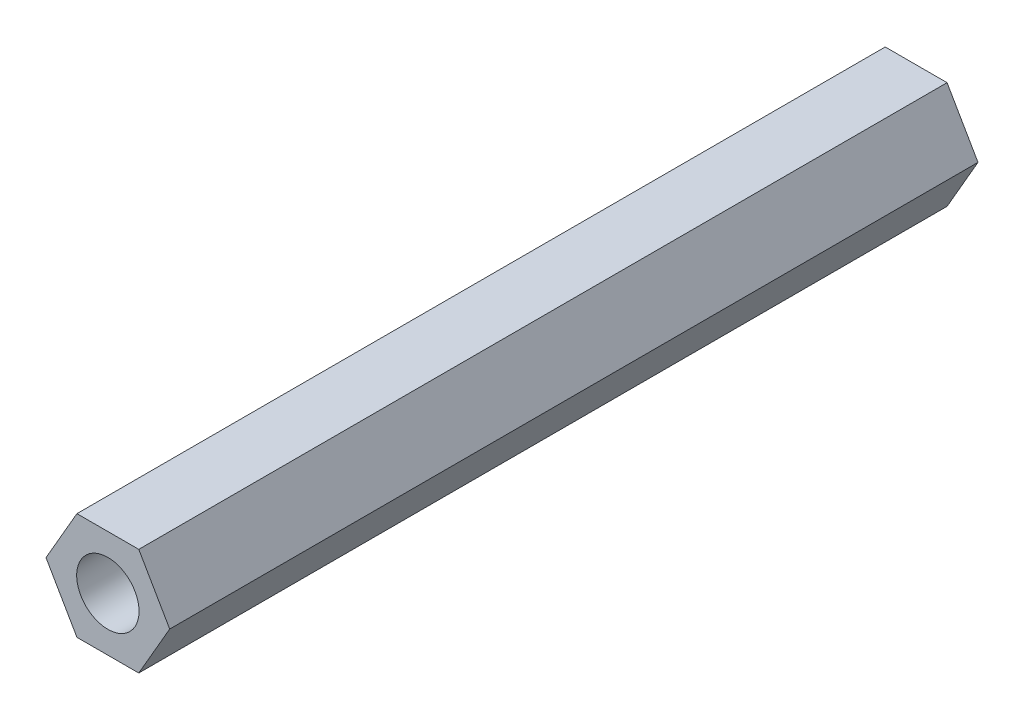
ISO-10303-21;
HEADER;
FILE_DESCRIPTION(('STEP AP214'),'2;1');
FILE_NAME('part.step','',(''),(''),'','','');
FILE_SCHEMA(('AUTOMOTIVE_DESIGN { 1 0 10303 214 1 1 1 1 }'));
ENDSEC;
DATA;
#1=APPLICATION_CONTEXT('core data for automotive mechanical design processes');
#2=APPLICATION_PROTOCOL_DEFINITION('international standard','automotive_design',2000,#1);
#3=PRODUCT_CONTEXT('',#1,'mechanical');
#4=PRODUCT('Part','Part','',(#3));
#5=PRODUCT_RELATED_PRODUCT_CATEGORY('part','',(#4));
#6=PRODUCT_DEFINITION_FORMATION('','',#4);
#7=PRODUCT_DEFINITION_CONTEXT('part definition',#1,'design');
#8=PRODUCT_DEFINITION('design','',#6,#7);
#9=PRODUCT_DEFINITION_SHAPE('','',#8);
#10=(LENGTH_UNIT() NAMED_UNIT(*) SI_UNIT(.MILLI.,.METRE.));
#11=(NAMED_UNIT(*) PLANE_ANGLE_UNIT() SI_UNIT($,.RADIAN.));
#12=(NAMED_UNIT(*) SI_UNIT($,.STERADIAN.) SOLID_ANGLE_UNIT());
#13=UNCERTAINTY_MEASURE_WITH_UNIT(LENGTH_MEASURE(1.E-05),#10,'distance_accuracy_value','');
#14=(GEOMETRIC_REPRESENTATION_CONTEXT(3) GLOBAL_UNCERTAINTY_ASSIGNED_CONTEXT((#13)) GLOBAL_UNIT_ASSIGNED_CONTEXT((#10,
#11,#12)) REPRESENTATION_CONTEXT('',''));
#15=CARTESIAN_POINT('',(0.,0.,0.));
#16=DIRECTION('',(0.,0.,1.));
#17=DIRECTION('',(1.,0.,0.));
#18=AXIS2_PLACEMENT_3D('',#15,#16,#17);
#19=CARTESIAN_POINT('',(0.,0.,-1.));
#20=DIRECTION('',(0.,0.,-1.));
#21=DIRECTION('',(1.,0.,0.));
#22=AXIS2_PLACEMENT_3D('',#19,#20,#21);
#23=CYLINDRICAL_SURFACE('',#22,1.6);
#24=CARTESIAN_POINT('',(0.,0.,0.));
#25=DIRECTION('',(0.,0.,-1.));
#26=DIRECTION('',(1.,0.,0.));
#27=AXIS2_PLACEMENT_3D('',#24,#25,#26);
#28=CIRCLE('',#27,1.6);
#29=CARTESIAN_POINT('',(1.6,0.,0.));
#30=VERTEX_POINT('',#29);
#31=EDGE_CURVE('E151',#30,#30,#28,.T.);
#32=ORIENTED_EDGE('',*,*,#31,.T.);
#33=DIRECTION('',(0.,0.,1.));
#34=VECTOR('',#33,1.);
#35=CARTESIAN_POINT('',(1.6,0.,-1.));
#36=LINE('',#35,#34);
#37=CARTESIAN_POINT('',(1.6,0.,41.5));
#38=VERTEX_POINT('',#37);
#39=EDGE_CURVE('E9',#30,#38,#36,.T.);
#40=ORIENTED_EDGE('',*,*,#39,.T.);
#41=CARTESIAN_POINT('',(0.,0.,41.5));
#42=DIRECTION('',(0.,0.,-1.));
#43=DIRECTION('',(1.,0.,0.));
#44=AXIS2_PLACEMENT_3D('',#41,#42,#43);
#45=CIRCLE('',#44,1.6);
#46=EDGE_CURVE('E166',#38,#38,#45,.T.);
#47=ORIENTED_EDGE('',*,*,#46,.F.);
#48=ORIENTED_EDGE('',*,*,#39,.F.);
#49=EDGE_LOOP('',(#32,#40,#47,#48));
#50=FACE_BOUND('',#49,.T.);
#51=ADVANCED_FACE('F15',(#50),#23,.F.);
#52=CARTESIAN_POINT('',(-3.175426480543,0.,0.));
#53=DIRECTION('',(0.866025403784329,0.50000000000019,0.));
#54=DIRECTION('',(0.,0.,-1.));
#55=AXIS2_PLACEMENT_3D('',#52,#53,#54);
#56=PLANE('',#55);
#57=DIRECTION('',(0.50000000000019,-0.866025403784329,0.));
#58=VECTOR('',#57,1.);
#59=CARTESIAN_POINT('',(-3.175426480543,0.,0.));
#60=LINE('',#59,#58);
#61=CARTESIAN_POINT('',(-3.175426480543,0.,0.));
#62=VERTEX_POINT('',#61);
#63=CARTESIAN_POINT('',(-1.587713240271,-2.75,0.));
#64=VERTEX_POINT('',#63);
#65=EDGE_CURVE('E147',#62,#64,#60,.T.);
#66=ORIENTED_EDGE('',*,*,#65,.T.);
#67=DIRECTION('',(0.,0.,1.));
#68=VECTOR('',#67,1.);
#69=CARTESIAN_POINT('',(-1.587713240271,-2.75,0.));
#70=LINE('',#69,#68);
#71=CARTESIAN_POINT('',(-1.587713240271,-2.75,41.5));
#72=VERTEX_POINT('',#71);
#73=EDGE_CURVE('E42',#64,#72,#70,.T.);
#74=ORIENTED_EDGE('',*,*,#73,.T.);
#75=DIRECTION('',(0.50000000000019,-0.866025403784329,0.));
#76=VECTOR('',#75,1.);
#77=CARTESIAN_POINT('',(-3.175426480543,0.,41.5));
#78=LINE('',#77,#76);
#79=CARTESIAN_POINT('',(-3.175426480543,0.,41.5));
#80=VERTEX_POINT('',#79);
#81=EDGE_CURVE('E163',#80,#72,#78,.T.);
#82=ORIENTED_EDGE('',*,*,#81,.F.);
#83=DIRECTION('',(0.,0.,1.));
#84=VECTOR('',#83,1.);
#85=CARTESIAN_POINT('',(-3.175426480543,0.,0.));
#86=LINE('',#85,#84);
#87=EDGE_CURVE('E24',#62,#80,#86,.T.);
#88=ORIENTED_EDGE('',*,*,#87,.F.);
#89=EDGE_LOOP('',(#66,#74,#82,#88));
#90=FACE_BOUND('',#89,.T.);
#91=ADVANCED_FACE('F17',(#90),#56,.F.);
#92=CARTESIAN_POINT('',(-1.587713240271,2.75,0.));
#93=DIRECTION('',(0.866025403784329,-0.50000000000019,0.));
#94=DIRECTION('',(0.,0.,-1.));
#95=AXIS2_PLACEMENT_3D('',#92,#93,#94);
#96=PLANE('',#95);
#97=DIRECTION('',(-0.50000000000019,-0.866025403784329,0.));
#98=VECTOR('',#97,1.);
#99=CARTESIAN_POINT('',(-1.587713240271,2.75,0.));
#100=LINE('',#99,#98);
#101=CARTESIAN_POINT('',(-1.587713240271,2.75,0.));
#102=VERTEX_POINT('',#101);
#103=EDGE_CURVE('E154',#102,#62,#100,.T.);
#104=ORIENTED_EDGE('',*,*,#103,.T.);
#105=ORIENTED_EDGE('',*,*,#87,.T.);
#106=DIRECTION('',(-0.50000000000019,-0.866025403784329,0.));
#107=VECTOR('',#106,1.);
#108=CARTESIAN_POINT('',(-1.587713240271,2.75,41.5));
#109=LINE('',#108,#107);
#110=CARTESIAN_POINT('',(-1.587713240271,2.75,41.5));
#111=VERTEX_POINT('',#110);
#112=EDGE_CURVE('E152',#111,#80,#109,.T.);
#113=ORIENTED_EDGE('',*,*,#112,.F.);
#114=DIRECTION('',(0.,0.,1.));
#115=VECTOR('',#114,1.);
#116=CARTESIAN_POINT('',(-1.587713240271,2.75,0.));
#117=LINE('',#116,#115);
#118=EDGE_CURVE('E138',#102,#111,#117,.T.);
#119=ORIENTED_EDGE('',*,*,#118,.F.);
#120=EDGE_LOOP('',(#104,#105,#113,#119));
#121=FACE_BOUND('',#120,.T.);
#122=ADVANCED_FACE('F176',(#121),#96,.F.);
#123=CARTESIAN_POINT('',(-1.587713240271,-2.75,0.));
#124=DIRECTION('',(0.,1.,0.));
#125=DIRECTION('',(1.,0.,0.));
#126=AXIS2_PLACEMENT_3D('',#123,#124,#125);
#127=PLANE('',#126);
#128=DIRECTION('',(1.,0.,0.));
#129=VECTOR('',#128,1.);
#130=CARTESIAN_POINT('',(-1.587713240271,-2.75,0.));
#131=LINE('',#130,#129);
#132=CARTESIAN_POINT('',(1.587713240271,-2.75,0.));
#133=VERTEX_POINT('',#132);
#134=EDGE_CURVE('E140',#64,#133,#131,.T.);
#135=ORIENTED_EDGE('',*,*,#134,.T.);
#136=DIRECTION('',(0.,0.,1.));
#137=VECTOR('',#136,1.);
#138=CARTESIAN_POINT('',(1.587713240271,-2.75,0.));
#139=LINE('',#138,#137);
#140=CARTESIAN_POINT('',(1.587713240271,-2.75,41.5));
#141=VERTEX_POINT('',#140);
#142=EDGE_CURVE('E107',#133,#141,#139,.T.);
#143=ORIENTED_EDGE('',*,*,#142,.T.);
#144=DIRECTION('',(1.,0.,0.));
#145=VECTOR('',#144,1.);
#146=CARTESIAN_POINT('',(-1.587713240271,-2.75,41.5));
#147=LINE('',#146,#145);
#148=EDGE_CURVE('E103',#72,#141,#147,.T.);
#149=ORIENTED_EDGE('',*,*,#148,.F.);
#150=ORIENTED_EDGE('',*,*,#73,.F.);
#151=EDGE_LOOP('',(#135,#143,#149,#150));
#152=FACE_BOUND('',#151,.T.);
#153=ADVANCED_FACE('F184',(#152),#127,.F.);
#154=CARTESIAN_POINT('',(0.,0.,41.5));
#155=DIRECTION('',(0.,0.,1.));
#156=DIRECTION('',(1.,0.,0.));
#157=AXIS2_PLACEMENT_3D('',#154,#155,#156);
#158=PLANE('',#157);
#159=ORIENTED_EDGE('',*,*,#46,.T.);
#160=EDGE_LOOP('',(#159));
#161=FACE_BOUND('',#160,.T.);
#162=DIRECTION('',(-0.50000000000019,0.866025403784329,0.));
#163=VECTOR('',#162,1.);
#164=CARTESIAN_POINT('',(3.175426480543,0.,41.5));
#165=LINE('',#164,#163);
#166=CARTESIAN_POINT('',(3.175426480543,0.,41.5));
#167=VERTEX_POINT('',#166);
#168=CARTESIAN_POINT('',(1.587713240271,2.75,41.5));
#169=VERTEX_POINT('',#168);
#170=EDGE_CURVE('E99',#167,#169,#165,.T.);
#171=ORIENTED_EDGE('',*,*,#170,.T.);
#172=DIRECTION('',(-1.,0.,0.));
#173=VECTOR('',#172,1.);
#174=CARTESIAN_POINT('',(1.587713240271,2.75,41.5));
#175=LINE('',#174,#173);
#176=EDGE_CURVE('E133',#169,#111,#175,.T.);
#177=ORIENTED_EDGE('',*,*,#176,.T.);
#178=ORIENTED_EDGE('',*,*,#112,.T.);
#179=ORIENTED_EDGE('',*,*,#81,.T.);
#180=ORIENTED_EDGE('',*,*,#148,.T.);
#181=DIRECTION('',(0.50000000000019,0.866025403784329,0.));
#182=VECTOR('',#181,1.);
#183=CARTESIAN_POINT('',(1.587713240271,-2.75,41.5));
#184=LINE('',#183,#182);
#185=EDGE_CURVE('E92',#141,#167,#184,.T.);
#186=ORIENTED_EDGE('',*,*,#185,.T.);
#187=EDGE_LOOP('',(#171,#177,#178,#179,#180,#186));
#188=FACE_BOUND('',#187,.T.);
#189=ADVANCED_FACE('F100',(#161,#188),#158,.T.);
#190=CARTESIAN_POINT('',(0.,0.,0.));
#191=DIRECTION('',(0.,0.,1.));
#192=DIRECTION('',(1.,0.,0.));
#193=AXIS2_PLACEMENT_3D('',#190,#191,#192);
#194=PLANE('',#193);
#195=ORIENTED_EDGE('',*,*,#31,.F.);
#196=EDGE_LOOP('',(#195));
#197=FACE_BOUND('',#196,.T.);
#198=DIRECTION('',(0.50000000000019,0.866025403784329,0.));
#199=VECTOR('',#198,1.);
#200=CARTESIAN_POINT('',(1.587713240271,-2.75,0.));
#201=LINE('',#200,#199);
#202=CARTESIAN_POINT('',(3.175426480543,0.,0.));
#203=VERTEX_POINT('',#202);
#204=EDGE_CURVE('E108',#133,#203,#201,.T.);
#205=ORIENTED_EDGE('',*,*,#204,.F.);
#206=ORIENTED_EDGE('',*,*,#134,.F.);
#207=ORIENTED_EDGE('',*,*,#65,.F.);
#208=ORIENTED_EDGE('',*,*,#103,.F.);
#209=DIRECTION('',(-1.,0.,0.));
#210=VECTOR('',#209,1.);
#211=CARTESIAN_POINT('',(1.587713240271,2.75,0.));
#212=LINE('',#211,#210);
#213=CARTESIAN_POINT('',(1.587713240271,2.75,0.));
#214=VERTEX_POINT('',#213);
#215=EDGE_CURVE('E143',#214,#102,#212,.T.);
#216=ORIENTED_EDGE('',*,*,#215,.F.);
#217=DIRECTION('',(-0.50000000000019,0.866025403784329,0.));
#218=VECTOR('',#217,1.);
#219=CARTESIAN_POINT('',(3.175426480543,0.,0.));
#220=LINE('',#219,#218);
#221=EDGE_CURVE('E128',#203,#214,#220,.T.);
#222=ORIENTED_EDGE('',*,*,#221,.F.);
#223=EDGE_LOOP('',(#205,#206,#207,#208,#216,#222));
#224=FACE_BOUND('',#223,.T.);
#225=ADVANCED_FACE('F181',(#197,#224),#194,.F.);
#226=CARTESIAN_POINT('',(1.587713240271,2.75,0.));
#227=DIRECTION('',(0.,-1.,0.));
#228=DIRECTION('',(-1.,0.,0.));
#229=AXIS2_PLACEMENT_3D('',#226,#227,#228);
#230=PLANE('',#229);
#231=ORIENTED_EDGE('',*,*,#215,.T.);
#232=ORIENTED_EDGE('',*,*,#118,.T.);
#233=ORIENTED_EDGE('',*,*,#176,.F.);
#234=DIRECTION('',(0.,0.,1.));
#235=VECTOR('',#234,1.);
#236=CARTESIAN_POINT('',(1.587713240271,2.75,0.));
#237=LINE('',#236,#235);
#238=EDGE_CURVE('E125',#214,#169,#237,.T.);
#239=ORIENTED_EDGE('',*,*,#238,.F.);
#240=EDGE_LOOP('',(#231,#232,#233,#239));
#241=FACE_BOUND('',#240,.T.);
#242=ADVANCED_FACE('F179',(#241),#230,.F.);
#243=CARTESIAN_POINT('',(1.587713240271,-2.75,0.));
#244=DIRECTION('',(-0.866025403784329,0.50000000000019,0.));
#245=DIRECTION('',(0.,0.,1.));
#246=AXIS2_PLACEMENT_3D('',#243,#244,#245);
#247=PLANE('',#246);
#248=ORIENTED_EDGE('',*,*,#204,.T.);
#249=DIRECTION('',(0.,0.,1.));
#250=VECTOR('',#249,1.);
#251=CARTESIAN_POINT('',(3.175426480543,0.,0.));
#252=LINE('',#251,#250);
#253=EDGE_CURVE('E115',#203,#167,#252,.T.);
#254=ORIENTED_EDGE('',*,*,#253,.T.);
#255=ORIENTED_EDGE('',*,*,#185,.F.);
#256=ORIENTED_EDGE('',*,*,#142,.F.);
#257=EDGE_LOOP('',(#248,#254,#255,#256));
#258=FACE_BOUND('',#257,.T.);
#259=ADVANCED_FACE('F114',(#258),#247,.F.);
#260=CARTESIAN_POINT('',(3.175426480543,0.,0.));
#261=DIRECTION('',(-0.866025403784329,-0.50000000000019,0.));
#262=DIRECTION('',(-0.50000000000019,0.866025403784329,0.));
#263=AXIS2_PLACEMENT_3D('',#260,#261,#262);
#264=PLANE('',#263);
#265=ORIENTED_EDGE('',*,*,#221,.T.);
#266=ORIENTED_EDGE('',*,*,#238,.T.);
#267=ORIENTED_EDGE('',*,*,#170,.F.);
#268=ORIENTED_EDGE('',*,*,#253,.F.);
#269=EDGE_LOOP('',(#265,#266,#267,#268));
#270=FACE_BOUND('',#269,.T.);
#271=ADVANCED_FACE('F120',(#270),#264,.F.);
#272=CLOSED_SHELL('',(#51,#91,#122,#153,#189,#225,#242,#259,#271));
#273=MANIFOLD_SOLID_BREP('B1',#272);
#274=ADVANCED_BREP_SHAPE_REPRESENTATION('',(#18,#273),#14);
#275=SHAPE_DEFINITION_REPRESENTATION(#9,#274);
ENDSEC;
END-ISO-10303-21;
